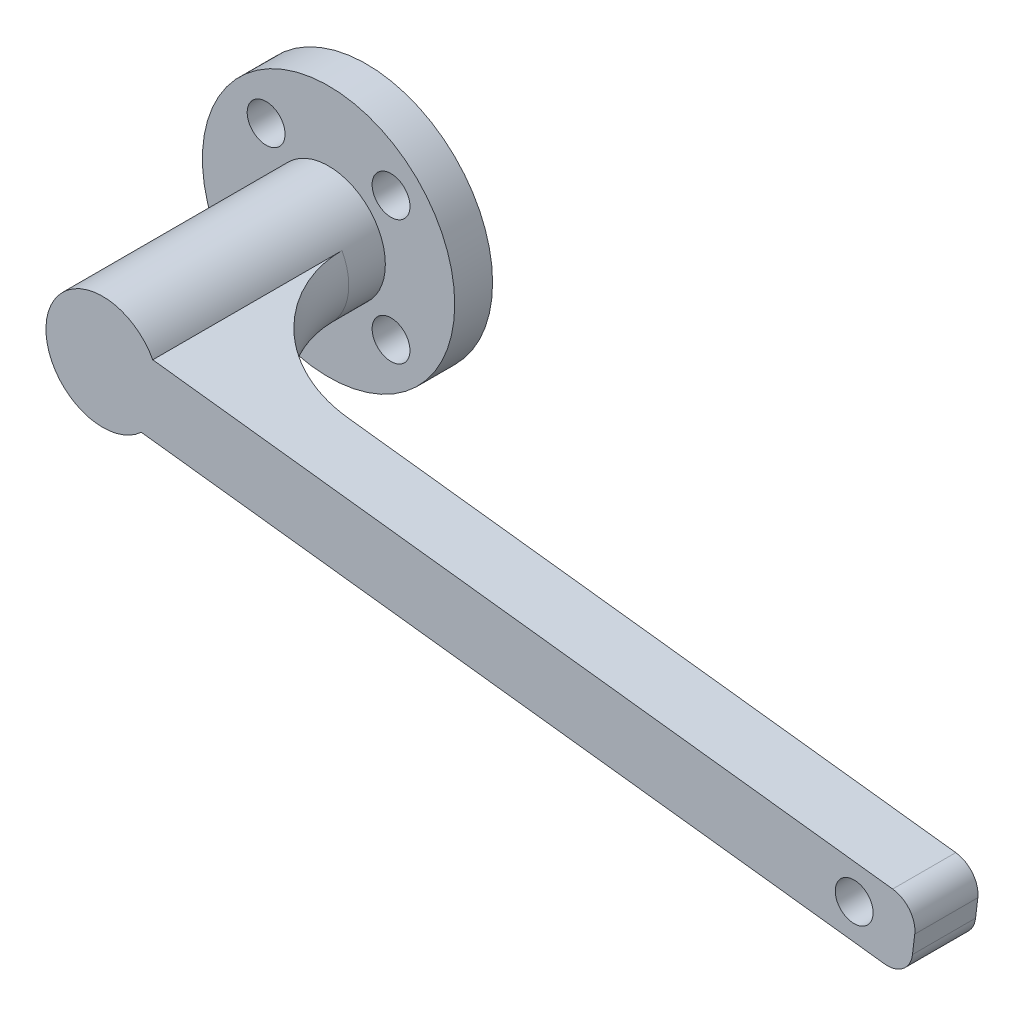
ISO-10303-21;
HEADER;
FILE_DESCRIPTION(('STEP AP214'),'2;1');
FILE_NAME('part.step','',(''),(''),'','','');
FILE_SCHEMA(('AUTOMOTIVE_DESIGN { 1 0 10303 214 1 1 1 1 }'));
ENDSEC;
DATA;
#1=APPLICATION_CONTEXT('core data for automotive mechanical design processes');
#2=APPLICATION_PROTOCOL_DEFINITION('international standard','automotive_design',2000,#1);
#3=PRODUCT_CONTEXT('',#1,'mechanical');
#4=PRODUCT('Part','Part','',(#3));
#5=PRODUCT_RELATED_PRODUCT_CATEGORY('part','',(#4));
#6=PRODUCT_DEFINITION_FORMATION('','',#4);
#7=PRODUCT_DEFINITION_CONTEXT('part definition',#1,'design');
#8=PRODUCT_DEFINITION('design','',#6,#7);
#9=PRODUCT_DEFINITION_SHAPE('','',#8);
#10=(LENGTH_UNIT() NAMED_UNIT(*) SI_UNIT(.MILLI.,.METRE.));
#11=(NAMED_UNIT(*) PLANE_ANGLE_UNIT() SI_UNIT($,.RADIAN.));
#12=(NAMED_UNIT(*) SI_UNIT($,.STERADIAN.) SOLID_ANGLE_UNIT());
#13=UNCERTAINTY_MEASURE_WITH_UNIT(LENGTH_MEASURE(1.E-05),#10,'distance_accuracy_value','');
#14=(GEOMETRIC_REPRESENTATION_CONTEXT(3) GLOBAL_UNCERTAINTY_ASSIGNED_CONTEXT((#13)) GLOBAL_UNIT_ASSIGNED_CONTEXT((#10,
#11,#12)) REPRESENTATION_CONTEXT('',''));
#15=CARTESIAN_POINT('',(0.,0.,0.));
#16=DIRECTION('',(0.,0.,1.));
#17=DIRECTION('',(1.,0.,0.));
#18=AXIS2_PLACEMENT_3D('',#15,#16,#17);
#19=CARTESIAN_POINT('',(63.9431331677481,-10.5758052824707,20.9));
#20=DIRECTION('',(0.118573999040062,0.992945218404141,0.));
#21=DIRECTION('',(-0.992945218404141,0.118573999040062,0.));
#22=AXIS2_PLACEMENT_3D('',#19,#20,#21);
#23=PLANE('',#22);
#24=DIRECTION('',(0.992945218404141,-0.118573999040062,0.));
#25=VECTOR('',#24,1.);
#26=CARTESIAN_POINT('',(63.9431331677481,-10.5758052824707,15.9));
#27=LINE('',#26,#25);
#28=CARTESIAN_POINT('',(13.7567660307454,-4.58272717661982,15.9));
#29=VERTEX_POINT('',#28);
#30=CARTESIAN_POINT('',(61.9572427309398,-10.3386572843905,15.9));
#31=VERTEX_POINT('',#30);
#32=EDGE_CURVE('E145',#29,#31,#27,.T.);
#33=ORIENTED_EDGE('',*,*,#32,.T.);
#34=DIRECTION('',(0.,0.,-1.));
#35=VECTOR('',#34,1.);
#36=CARTESIAN_POINT('',(61.9572427309398,-10.3386572843905,20.9));
#37=LINE('',#36,#35);
#38=CARTESIAN_POINT('',(61.9572427309398,-10.3386572843905,20.9));
#39=VERTEX_POINT('',#38);
#40=EDGE_CURVE('E69',#31,#39,#37,.F.);
#41=ORIENTED_EDGE('',*,*,#40,.T.);
#42=DIRECTION('',(0.992945218404141,-0.118573999040062,0.));
#43=VECTOR('',#42,1.);
#44=CARTESIAN_POINT('',(63.9431331677481,-10.5758052824707,20.9));
#45=LINE('',#44,#43);
#46=CARTESIAN_POINT('',(3.05435276939585,-3.30468291369746,20.9));
#47=VERTEX_POINT('',#46);
#48=EDGE_CURVE('E146',#47,#39,#45,.T.);
#49=ORIENTED_EDGE('',*,*,#48,.F.);
#50=DIRECTION('',(0.,0.,-1.));
#51=VECTOR('',#50,1.);
#52=CARTESIAN_POINT('',(3.05435276939585,-3.30468291369746,20.9));
#53=LINE('',#52,#51);
#54=CARTESIAN_POINT('',(3.05435276939585,-3.30468291369746,5.9));
#55=VERTEX_POINT('',#54);
#56=EDGE_CURVE('E124',#47,#55,#53,.T.);
#57=ORIENTED_EDGE('',*,*,#56,.T.);
#58=CARTESIAN_POINT('',(3.05435276939585,-3.30468291369746,5.9));
#59=CARTESIAN_POINT('',(3.05434999232685,-3.30468258206972,5.99537794863806));
#60=CARTESIAN_POINT('',(3.05613361438933,-3.30489557589536,6.09074672120769));
#61=CARTESIAN_POINT('',(3.0632461932504,-3.30574493485637,6.28134510524823));
#62=CARTESIAN_POINT('',(3.06857495995679,-3.3063812772916,6.37657472390626));
#63=CARTESIAN_POINT('',(3.08982399487887,-3.30891876173662,6.66170006937823));
#64=CARTESIAN_POINT('',(3.11100710804554,-3.31144837403923,6.85122221138357));
#65=CARTESIAN_POINT('',(3.1667200716192,-3.3181014187056,7.22727822618177));
#66=CARTESIAN_POINT('',(3.20118348356114,-3.32221691722332,7.41382223506672));
#67=CARTESIAN_POINT('',(3.28267804129588,-3.33194870849589,7.78414716394817));
#68=CARTESIAN_POINT('',(3.32971336962525,-3.33756550071444,7.96792714285052));
#69=CARTESIAN_POINT('',(3.46034165231591,-3.3531646672941,8.41771384420061));
#70=CARTESIAN_POINT('',(3.55072377418338,-3.36395777997838,8.68173692893589));
#71=CARTESIAN_POINT('',(3.75397125667755,-3.38822887404024,9.20086963287099));
#72=CARTESIAN_POINT('',(3.8668451377268,-3.40170787289648,9.45597583095891));
#73=CARTESIAN_POINT('',(4.11313846007895,-3.43111934860216,9.95698879738366));
#74=CARTESIAN_POINT('',(4.2466276013333,-3.44706014877278,10.2028607018602));
#75=CARTESIAN_POINT('',(4.5319802719354,-3.48113595342233,10.6834735846013));
#76=CARTESIAN_POINT('',(4.68384189166891,-3.49927072986191,10.9182157161576));
#77=CARTESIAN_POINT('',(5.0069077909233,-3.53785011462357,11.3790964864557));
#78=CARTESIAN_POINT('',(5.17836884241638,-3.55832538574459,11.6050524071989));
#79=CARTESIAN_POINT('',(5.5375518253352,-3.60121774464056,12.0435884846672));
#80=CARTESIAN_POINT('',(5.72527998067509,-3.62363557565327,12.2561634675639));
#81=CARTESIAN_POINT('',(6.11558591369742,-3.67024452695262,12.666476395441));
#82=CARTESIAN_POINT('',(6.31814401538165,-3.69443329760128,12.8642333198185));
#83=CARTESIAN_POINT('',(6.73726436092425,-3.74448316392715,13.2440782398199));
#84=CARTESIAN_POINT('',(6.95382696950827,-3.7703443031586,13.4261658270723));
#85=CARTESIAN_POINT('',(7.42982492321007,-3.82718629187982,13.7968463792906));
#86=CARTESIAN_POINT('',(7.69111385353212,-3.85838848994567,13.9830338079937));
#87=CARTESIAN_POINT('',(8.22863495069647,-3.92257735442463,14.3321426254426));
#88=CARTESIAN_POINT('',(8.50486880705467,-3.95556422259374,14.4950613760671));
#89=CARTESIAN_POINT('',(9.07041058375783,-4.02309921731953,14.7960766255395));
#90=CARTESIAN_POINT('',(9.35971982371962,-4.05764750146016,14.9341706119468));
#91=CARTESIAN_POINT('',(9.94929613949905,-4.12805261566538,15.1840850037406));
#92=CARTESIAN_POINT('',(10.2495616141733,-4.16390925452711,15.2959092305622));
#93=CARTESIAN_POINT('',(10.8124342827889,-4.23112551382424,15.4771421778154));
#94=CARTESIAN_POINT('',(11.0738215529771,-4.2623394552884,15.5504155099934));
#95=CARTESIAN_POINT('',(11.6013756330229,-4.3253380939056,15.6765801572827));
#96=CARTESIAN_POINT('',(11.8675417189798,-4.357122704613,15.7294745326098));
#97=CARTESIAN_POINT('',(12.4033443627244,-4.42110635747469,15.8144124069935));
#98=CARTESIAN_POINT('',(12.6729833957264,-4.45330569521029,15.8464400875774));
#99=CARTESIAN_POINT('',(13.213997041411,-4.51791162745615,15.8892497687257));
#100=CARTESIAN_POINT('',(13.4853721452972,-4.5503182806242,15.9000254629634));
#101=CARTESIAN_POINT('',(13.7567660307454,-4.58272717661982,15.9));
#102=B_SPLINE_CURVE_WITH_KNOTS('',3,(#58,#59,#60,#61,#62,#63,#64,#65,#66,#67,#68,#69,#70,#71,
#72,#73,#74,#75,#76,#77,#78,#79,#80,#81,#82,#83,#84,#85,#86,#87,#88,#89,#90,#91,#92,#93,#94,#95,
#96,#97,#98,#99,#100,#101),.UNSPECIFIED.,.F.,.F.,(4,2,2,2,2,2,2,2,2,2,2,2,2,2,2,2,2,2,2,2,2,4),
(0.,0.286098965976579,0.572182592438643,1.14378151494543,1.7125572178255,2.28152238208431,
3.11810974455371,3.9550146311272,4.79481366704905,5.63452549009782,6.48687849950666,
7.33955907771439,8.19112815653302,9.04271942208591,10.008578677711,10.9745473522984,
11.9406137347275,12.9065394973239,13.7255248573495,14.5443871860711,15.3638695519528,
16.1835950549401),.UNSPECIFIED.);
#103=EDGE_CURVE('E218',#55,#29,#102,.T.);
#104=ORIENTED_EDGE('',*,*,#103,.T.);
#105=EDGE_LOOP('',(#33,#41,#49,#57,#104));
#106=FACE_BOUND('',#105,.T.);
#107=ADVANCED_FACE('F45',(#106),#23,.F.);
#108=CARTESIAN_POINT('',(64.5952901624685,-5.1146065812479,20.9));
#109=DIRECTION('',(-0.118573999040061,-0.992945218404141,0.));
#110=DIRECTION('',(0.992945218404141,-0.118573999040061,0.));
#111=AXIS2_PLACEMENT_3D('',#108,#109,#110);
#112=PLANE('',#111);
#113=DIRECTION('',(-0.992945218404141,0.118573999040061,0.));
#114=VECTOR('',#113,1.);
#115=CARTESIAN_POINT('',(64.5952901624685,-5.1146065812479,20.9));
#116=LINE('',#115,#114);
#117=CARTESIAN_POINT('',(62.6093997256602,-4.87745858316778,20.9));
#118=VERTEX_POINT('',#117);
#119=CARTESIAN_POINT('',(3.9664004294167,2.12548056531293,20.9));
#120=VERTEX_POINT('',#119);
#121=EDGE_CURVE('E106',#118,#120,#116,.T.);
#122=ORIENTED_EDGE('',*,*,#121,.F.);
#123=DIRECTION('',(0.,0.,-1.));
#124=VECTOR('',#123,1.);
#125=CARTESIAN_POINT('',(62.6093997256602,-4.87745858316778,20.9));
#126=LINE('',#125,#124);
#127=CARTESIAN_POINT('',(62.6093997256602,-4.87745858316778,15.9));
#128=VERTEX_POINT('',#127);
#129=EDGE_CURVE('E11',#118,#128,#126,.T.);
#130=ORIENTED_EDGE('',*,*,#129,.T.);
#131=DIRECTION('',(-0.992945218404141,0.118573999040061,0.));
#132=VECTOR('',#131,1.);
#133=CARTESIAN_POINT('',(64.5952901624685,-5.1146065812479,15.9));
#134=LINE('',#133,#132);
#135=CARTESIAN_POINT('',(14.4738331604706,0.8707201863185,15.9));
#136=VERTEX_POINT('',#135);
#137=EDGE_CURVE('E149',#128,#136,#134,.T.);
#138=ORIENTED_EDGE('',*,*,#137,.T.);
#139=CARTESIAN_POINT('',(14.4738331604706,0.870720186318503,15.9));
#140=CARTESIAN_POINT('',(14.1670260377144,0.907358005610928,15.9000424816341));
#141=CARTESIAN_POINT('',(13.860243159637,0.943992929689751,15.8861351585177));
#142=CARTESIAN_POINT('',(13.2491769236437,1.01696429400785,15.8309055704507));
#143=CARTESIAN_POINT('',(12.9448930875731,1.05330079134667,15.7895886797567));
#144=CARTESIAN_POINT('',(12.3419582847644,1.12530112873121,15.6801702563931));
#145=CARTESIAN_POINT('',(12.0432944676889,1.16096650331866,15.61214039711));
#146=CARTESIAN_POINT('',(11.453021283092,1.23145483512841,15.4500488897531));
#147=CARTESIAN_POINT('',(11.1614118284636,1.2662778027527,15.3559875632934));
#148=CARTESIAN_POINT('',(10.6003513999879,1.3332776507548,15.147592354449));
#149=CARTESIAN_POINT('',(10.3304942992505,1.36550302936654,15.0343646683573));
#150=CARTESIAN_POINT('',(9.80090207550544,1.42874505588125,14.7860082348489));
#151=CARTESIAN_POINT('',(9.5411671779713,1.45976167685897,14.6508789999175));
#152=CARTESIAN_POINT('',(9.03345704819828,1.52039062126045,14.3598224948078));
#153=CARTESIAN_POINT('',(8.78548191874214,1.55000293241025,14.2038950428942));
#154=CARTESIAN_POINT('',(8.30279769662562,1.60764337160979,13.8724430572879));
#155=CARTESIAN_POINT('',(8.06808901736214,1.63567145029314,13.6969179134165));
#156=CARTESIAN_POINT('',(7.60543084218996,1.69092044993776,13.3211168325772));
#157=CARTESIAN_POINT('',(7.37800056043998,1.71807936818427,13.1201922700796));
#158=CARTESIAN_POINT('',(6.94022310319891,1.77035720066942,12.7000905643682));
#159=CARTESIAN_POINT('',(6.72988385952131,1.795475167719,12.4809050408819));
#160=CARTESIAN_POINT('',(6.32749776266316,1.84352668937221,12.0254490104331));
#161=CARTESIAN_POINT('',(6.13548234186297,1.86645649043236,11.7891503268356));
#162=CARTESIAN_POINT('',(5.77173578895172,1.90989381468379,11.3013836928632));
#163=CARTESIAN_POINT('',(5.59999493661606,1.93040249862984,11.0499230996325));
#164=CARTESIAN_POINT('',(5.27488931084738,1.96922546030316,10.5275922958403));
#165=CARTESIAN_POINT('',(5.12200165258374,1.98748276262778,10.2564201376459));
#166=CARTESIAN_POINT('',(4.84113847563109,2.02102244785623,9.70117409438204));
#167=CARTESIAN_POINT('',(4.71316827150158,2.0363041961142,9.4170974728628));
#168=CARTESIAN_POINT('',(4.48520369068539,2.06352691846168,8.83898263147255));
#169=CARTESIAN_POINT('',(4.38510393733675,2.0754804762587,8.54498677947041));
#170=CARTESIAN_POINT('',(4.21522181030392,2.0957671978163,7.94841851865634));
#171=CARTESIAN_POINT('',(4.14541332475585,2.10410347976312,7.64585373715739));
#172=CARTESIAN_POINT('',(4.05063777965807,2.11542123947952,7.10279202779571));
#173=CARTESIAN_POINT('',(4.01915278474252,2.11918106599129,6.86344637047822));
#174=CARTESIAN_POINT('',(3.98755810041665,2.12295399122371,6.50299438270844));
#175=CARTESIAN_POINT('',(3.97963196274728,2.1239005024944,6.3825484839495));
#176=CARTESIAN_POINT('',(3.96905022551276,2.12516413605387,6.1414062867572));
#177=CARTESIAN_POINT('',(3.96639532865287,2.12548117442807,6.02070995708569));
#178=CARTESIAN_POINT('',(3.9664004294167,2.12548056531293,5.9));
#179=B_SPLINE_CURVE_WITH_KNOTS('',3,(#139,#140,#141,#142,#143,#144,#145,#146,#147,#148,#149,
#150,#151,#152,#153,#154,#155,#156,#157,#158,#159,#160,#161,#162,#163,#164,#165,#166,#167,#168,
#169,#170,#171,#172,#173,#174,#175,#176,#177,#178),.UNSPECIFIED.,.F.,.F.,(4,2,2,2,2,2,2,2,2,2,2,
2,2,2,2,2,2,2,2,4),(0.,0.926612562432433,1.85304349549138,2.77700552874919,3.70095614713401,
4.58321788337943,5.46549926090999,6.34778834833662,7.23010491370256,8.1431166573419,
9.05654973062936,9.9715225396379,10.8860548867988,11.8203434177041,12.7548310020928,
13.6857358149224,14.6158365615602,15.3392141375379,15.7012396342737,16.0633133891238),.UNSPECIFIED.);
#180=CARTESIAN_POINT('',(3.9664004294167,2.12548056531293,5.9));
#181=VERTEX_POINT('',#180);
#182=EDGE_CURVE('E130',#136,#181,#179,.T.);
#183=ORIENTED_EDGE('',*,*,#182,.T.);
#184=DIRECTION('',(0.,0.,-1.));
#185=VECTOR('',#184,1.);
#186=CARTESIAN_POINT('',(3.9664004294167,2.12548056531293,20.9));
#187=LINE('',#186,#185);
#188=EDGE_CURVE('E122',#120,#181,#187,.T.);
#189=ORIENTED_EDGE('',*,*,#188,.F.);
#190=EDGE_LOOP('',(#122,#130,#138,#183,#189));
#191=FACE_BOUND('',#190,.T.);
#192=ADVANCED_FACE('F128',(#191),#112,.F.);
#193=CARTESIAN_POINT('',(0.,0.,3.));
#194=DIRECTION('',(0.,0.,-1.));
#195=DIRECTION('',(-1.,0.,0.));
#196=AXIS2_PLACEMENT_3D('',#193,#194,#195);
#197=CYLINDRICAL_SURFACE('',#196,10.);
#198=CARTESIAN_POINT('',(0.,0.,3.));
#199=DIRECTION('',(0.,0.,1.));
#200=DIRECTION('',(1.,0.,0.));
#201=AXIS2_PLACEMENT_3D('',#198,#199,#200);
#202=CIRCLE('',#201,10.);
#203=CARTESIAN_POINT('',(10.,0.,3.));
#204=VERTEX_POINT('',#203);
#205=EDGE_CURVE('E165',#204,#204,#202,.T.);
#206=ORIENTED_EDGE('',*,*,#205,.F.);
#207=EDGE_LOOP('',(#206));
#208=FACE_BOUND('',#207,.T.);
#209=CARTESIAN_POINT('',(0.,0.,0.));
#210=DIRECTION('',(0.,0.,1.));
#211=DIRECTION('',(1.,0.,0.));
#212=AXIS2_PLACEMENT_3D('',#209,#210,#211);
#213=CIRCLE('',#212,10.);
#214=CARTESIAN_POINT('',(10.,0.,0.));
#215=VERTEX_POINT('',#214);
#216=EDGE_CURVE('E194',#215,#215,#213,.T.);
#217=ORIENTED_EDGE('',*,*,#216,.T.);
#218=EDGE_LOOP('',(#217));
#219=FACE_BOUND('',#218,.T.);
#220=ADVANCED_FACE('F235',(#208,#219),#197,.T.);
#221=CARTESIAN_POINT('',(0.,0.,3.));
#222=DIRECTION('',(0.,0.,1.));
#223=DIRECTION('',(1.,0.,0.));
#224=AXIS2_PLACEMENT_3D('',#221,#222,#223);
#225=PLANE('',#224);
#226=CARTESIAN_POINT('',(0.,0.,3.));
#227=DIRECTION('',(0.,0.,1.));
#228=DIRECTION('',(1.,0.,0.));
#229=AXIS2_PLACEMENT_3D('',#226,#227,#228);
#230=CIRCLE('',#229,4.5);
#231=CARTESIAN_POINT('',(4.5,0.,3.));
#232=VERTEX_POINT('',#231);
#233=EDGE_CURVE('E160',#232,#232,#230,.T.);
#234=ORIENTED_EDGE('',*,*,#233,.F.);
#235=EDGE_LOOP('',(#234));
#236=FACE_BOUND('',#235,.T.);
#237=CARTESIAN_POINT('',(4.95,4.95,3.));
#238=DIRECTION('',(0.,0.,1.));
#239=DIRECTION('',(1.,0.,0.));
#240=AXIS2_PLACEMENT_3D('',#237,#238,#239);
#241=CIRCLE('',#240,1.5);
#242=CARTESIAN_POINT('',(6.45,4.95,3.));
#243=VERTEX_POINT('',#242);
#244=EDGE_CURVE('E174',#243,#243,#241,.T.);
#245=ORIENTED_EDGE('',*,*,#244,.F.);
#246=EDGE_LOOP('',(#245));
#247=FACE_BOUND('',#246,.T.);
#248=CARTESIAN_POINT('',(-4.95,-4.95,3.));
#249=DIRECTION('',(0.,0.,1.));
#250=DIRECTION('',(1.,0.,0.));
#251=AXIS2_PLACEMENT_3D('',#248,#249,#250);
#252=CIRCLE('',#251,1.5);
#253=CARTESIAN_POINT('',(-3.45,-4.95,3.));
#254=VERTEX_POINT('',#253);
#255=EDGE_CURVE('E183',#254,#254,#252,.T.);
#256=ORIENTED_EDGE('',*,*,#255,.F.);
#257=EDGE_LOOP('',(#256));
#258=FACE_BOUND('',#257,.T.);
#259=CARTESIAN_POINT('',(4.95,-4.95,3.));
#260=DIRECTION('',(0.,0.,1.));
#261=DIRECTION('',(1.,0.,0.));
#262=AXIS2_PLACEMENT_3D('',#259,#260,#261);
#263=CIRCLE('',#262,1.5);
#264=CARTESIAN_POINT('',(6.45,-4.95,3.));
#265=VERTEX_POINT('',#264);
#266=EDGE_CURVE('E166',#265,#265,#263,.T.);
#267=ORIENTED_EDGE('',*,*,#266,.F.);
#268=EDGE_LOOP('',(#267));
#269=FACE_BOUND('',#268,.T.);
#270=CARTESIAN_POINT('',(-4.95,4.95,3.));
#271=DIRECTION('',(0.,0.,1.));
#272=DIRECTION('',(1.,0.,0.));
#273=AXIS2_PLACEMENT_3D('',#270,#271,#272);
#274=CIRCLE('',#273,1.5);
#275=CARTESIAN_POINT('',(-3.45,4.95,3.));
#276=VERTEX_POINT('',#275);
#277=EDGE_CURVE('E178',#276,#276,#274,.T.);
#278=ORIENTED_EDGE('',*,*,#277,.F.);
#279=EDGE_LOOP('',(#278));
#280=FACE_BOUND('',#279,.T.);
#281=ORIENTED_EDGE('',*,*,#205,.T.);
#282=EDGE_LOOP('',(#281));
#283=FACE_BOUND('',#282,.T.);
#284=ADVANCED_FACE('F273',(#236,#247,#258,#269,#280,#283),#225,.T.);
#285=CARTESIAN_POINT('',(0.,0.,0.));
#286=DIRECTION('',(0.,0.,1.));
#287=DIRECTION('',(1.,0.,0.));
#288=AXIS2_PLACEMENT_3D('',#285,#286,#287);
#289=PLANE('',#288);
#290=CARTESIAN_POINT('',(0.,0.,0.));
#291=DIRECTION('',(0.,0.,-1.));
#292=DIRECTION('',(-1.,0.,0.));
#293=AXIS2_PLACEMENT_3D('',#290,#291,#292);
#294=CIRCLE('',#293,3.75);
#295=CARTESIAN_POINT('',(-3.75,0.,0.));
#296=VERTEX_POINT('',#295);
#297=EDGE_CURVE('E283',#296,#296,#294,.T.);
#298=ORIENTED_EDGE('',*,*,#297,.F.);
#299=EDGE_LOOP('',(#298));
#300=FACE_BOUND('',#299,.T.);
#301=CARTESIAN_POINT('',(4.95,4.95,0.));
#302=DIRECTION('',(0.,0.,1.));
#303=DIRECTION('',(1.,0.,0.));
#304=AXIS2_PLACEMENT_3D('',#301,#302,#303);
#305=CIRCLE('',#304,1.5);
#306=CARTESIAN_POINT('',(6.45,4.95,0.));
#307=VERTEX_POINT('',#306);
#308=EDGE_CURVE('E179',#307,#307,#305,.T.);
#309=ORIENTED_EDGE('',*,*,#308,.T.);
#310=EDGE_LOOP('',(#309));
#311=FACE_BOUND('',#310,.T.);
#312=CARTESIAN_POINT('',(-4.95,-4.95,0.));
#313=DIRECTION('',(0.,0.,1.));
#314=DIRECTION('',(1.,0.,0.));
#315=AXIS2_PLACEMENT_3D('',#312,#313,#314);
#316=CIRCLE('',#315,1.5);
#317=CARTESIAN_POINT('',(-3.45,-4.95,0.));
#318=VERTEX_POINT('',#317);
#319=EDGE_CURVE('E170',#318,#318,#316,.T.);
#320=ORIENTED_EDGE('',*,*,#319,.T.);
#321=EDGE_LOOP('',(#320));
#322=FACE_BOUND('',#321,.T.);
#323=CARTESIAN_POINT('',(4.95,-4.95,0.));
#324=DIRECTION('',(0.,0.,1.));
#325=DIRECTION('',(1.,0.,0.));
#326=AXIS2_PLACEMENT_3D('',#323,#324,#325);
#327=CIRCLE('',#326,1.5);
#328=CARTESIAN_POINT('',(6.45,-4.95,0.));
#329=VERTEX_POINT('',#328);
#330=EDGE_CURVE('E115',#329,#329,#327,.T.);
#331=ORIENTED_EDGE('',*,*,#330,.T.);
#332=EDGE_LOOP('',(#331));
#333=FACE_BOUND('',#332,.T.);
#334=CARTESIAN_POINT('',(-4.95,4.95,0.));
#335=DIRECTION('',(0.,0.,1.));
#336=DIRECTION('',(1.,0.,0.));
#337=AXIS2_PLACEMENT_3D('',#334,#335,#336);
#338=CIRCLE('',#337,1.5);
#339=CARTESIAN_POINT('',(-3.45,4.95,0.));
#340=VERTEX_POINT('',#339);
#341=EDGE_CURVE('E190',#340,#340,#338,.T.);
#342=ORIENTED_EDGE('',*,*,#341,.T.);
#343=EDGE_LOOP('',(#342));
#344=FACE_BOUND('',#343,.T.);
#345=ORIENTED_EDGE('',*,*,#216,.F.);
#346=EDGE_LOOP('',(#345));
#347=FACE_BOUND('',#346,.T.);
#348=ADVANCED_FACE('F271',(#300,#311,#322,#333,#344,#347),#289,.F.);
#349=CARTESIAN_POINT('',(-4.95,4.95,0.));
#350=DIRECTION('',(0.,0.,1.));
#351=DIRECTION('',(1.,0.,0.));
#352=AXIS2_PLACEMENT_3D('',#349,#350,#351);
#353=CYLINDRICAL_SURFACE('',#352,1.5);
#354=ORIENTED_EDGE('',*,*,#341,.F.);
#355=EDGE_LOOP('',(#354));
#356=FACE_BOUND('',#355,.T.);
#357=ORIENTED_EDGE('',*,*,#277,.T.);
#358=EDGE_LOOP('',(#357));
#359=FACE_BOUND('',#358,.T.);
#360=ADVANCED_FACE('F261',(#356,#359),#353,.F.);
#361=CARTESIAN_POINT('',(4.95,-4.95,0.));
#362=DIRECTION('',(0.,0.,1.));
#363=DIRECTION('',(1.,0.,0.));
#364=AXIS2_PLACEMENT_3D('',#361,#362,#363);
#365=CYLINDRICAL_SURFACE('',#364,1.5);
#366=ORIENTED_EDGE('',*,*,#330,.F.);
#367=EDGE_LOOP('',(#366));
#368=FACE_BOUND('',#367,.T.);
#369=ORIENTED_EDGE('',*,*,#266,.T.);
#370=EDGE_LOOP('',(#369));
#371=FACE_BOUND('',#370,.T.);
#372=ADVANCED_FACE('F257',(#368,#371),#365,.F.);
#373=CARTESIAN_POINT('',(-4.95,-4.95,0.));
#374=DIRECTION('',(0.,0.,1.));
#375=DIRECTION('',(1.,0.,0.));
#376=AXIS2_PLACEMENT_3D('',#373,#374,#375);
#377=CYLINDRICAL_SURFACE('',#376,1.5);
#378=ORIENTED_EDGE('',*,*,#319,.F.);
#379=EDGE_LOOP('',(#378));
#380=FACE_BOUND('',#379,.T.);
#381=ORIENTED_EDGE('',*,*,#255,.T.);
#382=EDGE_LOOP('',(#381));
#383=FACE_BOUND('',#382,.T.);
#384=ADVANCED_FACE('F260',(#380,#383),#377,.F.);
#385=CARTESIAN_POINT('',(4.95,4.95,0.));
#386=DIRECTION('',(0.,0.,1.));
#387=DIRECTION('',(1.,0.,0.));
#388=AXIS2_PLACEMENT_3D('',#385,#386,#387);
#389=CYLINDRICAL_SURFACE('',#388,1.5);
#390=ORIENTED_EDGE('',*,*,#308,.F.);
#391=EDGE_LOOP('',(#390));
#392=FACE_BOUND('',#391,.T.);
#393=ORIENTED_EDGE('',*,*,#244,.T.);
#394=EDGE_LOOP('',(#393));
#395=FACE_BOUND('',#394,.T.);
#396=ADVANCED_FACE('F256',(#392,#395),#389,.F.);
#397=CARTESIAN_POINT('',(0.,0.,15.9));
#398=DIRECTION('',(0.,0.,-1.));
#399=DIRECTION('',(-1.,0.,0.));
#400=AXIS2_PLACEMENT_3D('',#397,#398,#399);
#401=CYLINDRICAL_SURFACE('',#400,4.5);
#402=ORIENTED_EDGE('',*,*,#188,.T.);
#403=CARTESIAN_POINT('',(0.,0.,5.9));
#404=DIRECTION('',(0.,0.,1.));
#405=DIRECTION('',(1.,0.,0.));
#406=AXIS2_PLACEMENT_3D('',#403,#404,#405);
#407=CIRCLE('',#406,4.5);
#408=EDGE_CURVE('E207',#181,#55,#407,.F.);
#409=ORIENTED_EDGE('',*,*,#408,.T.);
#410=ORIENTED_EDGE('',*,*,#56,.F.);
#411=CARTESIAN_POINT('',(0.,0.,20.9));
#412=DIRECTION('',(0.,0.,1.));
#413=DIRECTION('',(1.,0.,0.));
#414=AXIS2_PLACEMENT_3D('',#411,#412,#413);
#415=CIRCLE('',#414,4.5);
#416=EDGE_CURVE('E110',#120,#47,#415,.T.);
#417=ORIENTED_EDGE('',*,*,#416,.F.);
#418=EDGE_LOOP('',(#402,#409,#410,#417));
#419=FACE_BOUND('',#418,.T.);
#420=ORIENTED_EDGE('',*,*,#233,.T.);
#421=EDGE_LOOP('',(#420));
#422=FACE_BOUND('',#421,.T.);
#423=ADVANCED_FACE('F119',(#419,#422),#401,.T.);
#424=CARTESIAN_POINT('',(0.,0.,15.9));
#425=DIRECTION('',(0.,0.,1.));
#426=DIRECTION('',(1.,0.,0.));
#427=AXIS2_PLACEMENT_3D('',#424,#425,#426);
#428=PLANE('',#427);
#429=CARTESIAN_POINT('',(59.5564132180687,-7.28242024320529,15.9));
#430=DIRECTION('',(0.,0.,1.));
#431=DIRECTION('',(1.,0.,0.));
#432=AXIS2_PLACEMENT_3D('',#429,#430,#431);
#433=CIRCLE('',#432,1.49999999999998);
#434=CARTESIAN_POINT('',(61.0564132180687,-7.28242024320529,15.9));
#435=VERTEX_POINT('',#434);
#436=EDGE_CURVE('E138',#435,#435,#433,.T.);
#437=ORIENTED_EDGE('',*,*,#436,.T.);
#438=EDGE_LOOP('',(#437));
#439=FACE_BOUND('',#438,.T.);
#440=DIRECTION('',(0.118573999040061,0.992945218404141,0.));
#441=VECTOR('',#440,1.);
#442=CARTESIAN_POINT('',(64.5952901624685,-5.1146065812479,15.9));
#443=LINE('',#442,#441);
#444=CARTESIAN_POINT('',(64.1802811658283,-8.58991484566239,15.9));
#445=VERTEX_POINT('',#444);
#446=CARTESIAN_POINT('',(64.3581421643883,-7.10049701805618,15.9));
#447=VERTEX_POINT('',#446);
#448=EDGE_CURVE('E154',#445,#447,#443,.T.);
#449=ORIENTED_EDGE('',*,*,#448,.F.);
#450=CARTESIAN_POINT('',(62.19439072902,-8.35276684758227,15.9));
#451=DIRECTION('',(0.,0.,1.));
#452=DIRECTION('',(1.,0.,0.));
#453=AXIS2_PLACEMENT_3D('',#450,#451,#452);
#454=CIRCLE('',#453,2.);
#455=EDGE_CURVE('E479',#445,#31,#454,.F.);
#456=ORIENTED_EDGE('',*,*,#455,.T.);
#457=ORIENTED_EDGE('',*,*,#32,.F.);
#458=CARTESIAN_POINT('',(0.,0.,15.9));
#459=DIRECTION('',(0.,0.,1.));
#460=DIRECTION('',(1.,0.,0.));
#461=AXIS2_PLACEMENT_3D('',#458,#459,#460);
#462=CIRCLE('',#461,14.5);
#463=EDGE_CURVE('E164',#29,#136,#462,.T.);
#464=ORIENTED_EDGE('',*,*,#463,.T.);
#465=ORIENTED_EDGE('',*,*,#137,.F.);
#466=CARTESIAN_POINT('',(62.3722517275801,-6.86334901997606,15.9));
#467=DIRECTION('',(0.,0.,1.));
#468=DIRECTION('',(1.,0.,0.));
#469=AXIS2_PLACEMENT_3D('',#466,#467,#468);
#470=CIRCLE('',#469,2.);
#471=EDGE_CURVE('E481',#128,#447,#470,.F.);
#472=ORIENTED_EDGE('',*,*,#471,.T.);
#473=EDGE_LOOP('',(#449,#456,#457,#464,#465,#472));
#474=FACE_BOUND('',#473,.T.);
#475=ADVANCED_FACE('F255',(#439,#474),#428,.F.);
#476=CARTESIAN_POINT('',(64.5952901624685,-5.1146065812479,20.9));
#477=DIRECTION('',(-0.992945218404141,0.118573999040061,0.));
#478=DIRECTION('',(-0.118573999040061,-0.992945218404141,0.));
#479=AXIS2_PLACEMENT_3D('',#476,#477,#478);
#480=PLANE('',#479);
#481=DIRECTION('',(0.118573999040061,0.992945218404141,0.));
#482=VECTOR('',#481,1.);
#483=CARTESIAN_POINT('',(64.5952901624685,-5.1146065812479,20.9));
#484=LINE('',#483,#482);
#485=CARTESIAN_POINT('',(64.1802811658283,-8.58991484566239,20.9));
#486=VERTEX_POINT('',#485);
#487=CARTESIAN_POINT('',(64.3581421643883,-7.10049701805618,20.9));
#488=VERTEX_POINT('',#487);
#489=EDGE_CURVE('E116',#486,#488,#484,.T.);
#490=ORIENTED_EDGE('',*,*,#489,.F.);
#491=DIRECTION('',(0.,0.,-1.));
#492=VECTOR('',#491,1.);
#493=CARTESIAN_POINT('',(64.1802811658283,-8.58991484566239,20.9));
#494=LINE('',#493,#492);
#495=EDGE_CURVE('E475',#486,#445,#494,.T.);
#496=ORIENTED_EDGE('',*,*,#495,.T.);
#497=ORIENTED_EDGE('',*,*,#448,.T.);
#498=DIRECTION('',(0.,0.,-1.));
#499=VECTOR('',#498,1.);
#500=CARTESIAN_POINT('',(64.3581421643883,-7.10049701805618,20.9));
#501=LINE('',#500,#499);
#502=EDGE_CURVE('E478',#447,#488,#501,.F.);
#503=ORIENTED_EDGE('',*,*,#502,.T.);
#504=EDGE_LOOP('',(#490,#496,#497,#503));
#505=FACE_BOUND('',#504,.T.);
#506=ADVANCED_FACE('F252',(#505),#480,.F.);
#507=CARTESIAN_POINT('',(0.,0.,20.9));
#508=DIRECTION('',(0.,0.,1.));
#509=DIRECTION('',(1.,0.,0.));
#510=AXIS2_PLACEMENT_3D('',#507,#508,#509);
#511=PLANE('',#510);
#512=ORIENTED_EDGE('',*,*,#48,.T.);
#513=CARTESIAN_POINT('',(62.19439072902,-8.35276684758227,20.9));
#514=DIRECTION('',(0.,0.,1.));
#515=DIRECTION('',(1.,0.,0.));
#516=AXIS2_PLACEMENT_3D('',#513,#514,#515);
#517=CIRCLE('',#516,2.);
#518=EDGE_CURVE('E54',#39,#486,#517,.T.);
#519=ORIENTED_EDGE('',*,*,#518,.T.);
#520=ORIENTED_EDGE('',*,*,#489,.T.);
#521=CARTESIAN_POINT('',(62.3722517275801,-6.86334901997606,20.9));
#522=DIRECTION('',(0.,0.,1.));
#523=DIRECTION('',(1.,0.,0.));
#524=AXIS2_PLACEMENT_3D('',#521,#522,#523);
#525=CIRCLE('',#524,2.);
#526=EDGE_CURVE('E61',#488,#118,#525,.T.);
#527=ORIENTED_EDGE('',*,*,#526,.T.);
#528=ORIENTED_EDGE('',*,*,#121,.T.);
#529=ORIENTED_EDGE('',*,*,#416,.T.);
#530=EDGE_LOOP('',(#512,#519,#520,#527,#528,#529));
#531=FACE_BOUND('',#530,.T.);
#532=CARTESIAN_POINT('',(59.5564132180687,-7.28242024320529,20.9));
#533=DIRECTION('',(0.,0.,1.));
#534=DIRECTION('',(1.,0.,0.));
#535=AXIS2_PLACEMENT_3D('',#532,#533,#534);
#536=CIRCLE('',#535,1.49999999999998);
#537=CARTESIAN_POINT('',(61.0564132180687,-7.28242024320529,20.9));
#538=VERTEX_POINT('',#537);
#539=EDGE_CURVE('E133',#538,#538,#536,.T.);
#540=ORIENTED_EDGE('',*,*,#539,.F.);
#541=EDGE_LOOP('',(#540));
#542=FACE_BOUND('',#541,.T.);
#543=ADVANCED_FACE('F108',(#531,#542),#511,.T.);
#544=CARTESIAN_POINT('',(59.5564132180687,-7.28242024320529,0.));
#545=DIRECTION('',(0.,0.,1.));
#546=DIRECTION('',(1.,0.,0.));
#547=AXIS2_PLACEMENT_3D('',#544,#545,#546);
#548=CYLINDRICAL_SURFACE('',#547,1.49999999999998);
#549=ORIENTED_EDGE('',*,*,#539,.T.);
#550=EDGE_LOOP('',(#549));
#551=FACE_BOUND('',#550,.T.);
#552=ORIENTED_EDGE('',*,*,#436,.F.);
#553=EDGE_LOOP('',(#552));
#554=FACE_BOUND('',#553,.T.);
#555=ADVANCED_FACE('F233',(#551,#554),#548,.F.);
#556=CARTESIAN_POINT('',(0.,0.,5.9));
#557=DIRECTION('',(0.,0.,1.));
#558=DIRECTION('',(1.,0.,0.));
#559=AXIS2_PLACEMENT_3D('',#556,#557,#558);
#560=TOROIDAL_SURFACE('',#559,14.5,10.);
#561=ORIENTED_EDGE('',*,*,#103,.F.);
#562=ORIENTED_EDGE('',*,*,#408,.F.);
#563=ORIENTED_EDGE('',*,*,#182,.F.);
#564=ORIENTED_EDGE('',*,*,#463,.F.);
#565=EDGE_LOOP('',(#561,#562,#563,#564));
#566=FACE_BOUND('',#565,.T.);
#567=ADVANCED_FACE('F228',(#566),#560,.F.);
#568=CARTESIAN_POINT('',(62.19439072902,-8.35276684758227,20.9));
#569=DIRECTION('',(0.,0.,-1.));
#570=DIRECTION('',(-1.,0.,0.));
#571=AXIS2_PLACEMENT_3D('',#568,#569,#570);
#572=CYLINDRICAL_SURFACE('',#571,2.);
#573=ORIENTED_EDGE('',*,*,#518,.F.);
#574=ORIENTED_EDGE('',*,*,#40,.F.);
#575=ORIENTED_EDGE('',*,*,#455,.F.);
#576=ORIENTED_EDGE('',*,*,#495,.F.);
#577=EDGE_LOOP('',(#573,#574,#575,#576));
#578=FACE_BOUND('',#577,.T.);
#579=ADVANCED_FACE('F232',(#578),#572,.T.);
#580=CARTESIAN_POINT('',(62.3722517275801,-6.86334901997606,20.9));
#581=DIRECTION('',(0.,0.,-1.));
#582=DIRECTION('',(-1.,0.,0.));
#583=AXIS2_PLACEMENT_3D('',#580,#581,#582);
#584=CYLINDRICAL_SURFACE('',#583,2.);
#585=ORIENTED_EDGE('',*,*,#526,.F.);
#586=ORIENTED_EDGE('',*,*,#502,.F.);
#587=ORIENTED_EDGE('',*,*,#471,.F.);
#588=ORIENTED_EDGE('',*,*,#129,.F.);
#589=EDGE_LOOP('',(#585,#586,#587,#588));
#590=FACE_BOUND('',#589,.T.);
#591=ADVANCED_FACE('F47',(#590),#584,.T.);
#592=CARTESIAN_POINT('',(0.,0.,3.));
#593=DIRECTION('',(0.,0.,-1.));
#594=DIRECTION('',(-1.,0.,0.));
#595=AXIS2_PLACEMENT_3D('',#592,#593,#594);
#596=CYLINDRICAL_SURFACE('',#595,3.75);
#597=CARTESIAN_POINT('',(0.,0.,3.));
#598=DIRECTION('',(0.,0.,-1.));
#599=DIRECTION('',(-1.,0.,0.));
#600=AXIS2_PLACEMENT_3D('',#597,#598,#599);
#601=CIRCLE('',#600,3.75);
#602=CARTESIAN_POINT('',(-3.75,0.,3.));
#603=VERTEX_POINT('',#602);
#604=EDGE_CURVE('E126',#603,#603,#601,.T.);
#605=ORIENTED_EDGE('',*,*,#604,.F.);
#606=EDGE_LOOP('',(#605));
#607=FACE_BOUND('',#606,.T.);
#608=ORIENTED_EDGE('',*,*,#297,.T.);
#609=EDGE_LOOP('',(#608));
#610=FACE_BOUND('',#609,.T.);
#611=ADVANCED_FACE('F243',(#607,#610),#596,.F.);
#612=CARTESIAN_POINT('',(0.,0.,3.));
#613=DIRECTION('',(0.,0.,-1.));
#614=DIRECTION('',(-1.,0.,0.));
#615=AXIS2_PLACEMENT_3D('',#612,#613,#614);
#616=PLANE('',#615);
#617=ORIENTED_EDGE('',*,*,#604,.T.);
#618=EDGE_LOOP('',(#617));
#619=FACE_BOUND('',#618,.T.);
#620=ADVANCED_FACE('F397',(#619),#616,.T.);
#621=CLOSED_SHELL('',(#107,#192,#220,#284,#348,#360,#372,#384,#396,#423,#475,#506,#543,#555,
#567,#579,#591,#611,#620));
#622=MANIFOLD_SOLID_BREP('B2',#621);
#623=ADVANCED_BREP_SHAPE_REPRESENTATION('',(#18,#622),#14);
#624=SHAPE_DEFINITION_REPRESENTATION(#9,#623);
ENDSEC;
END-ISO-10303-21;
